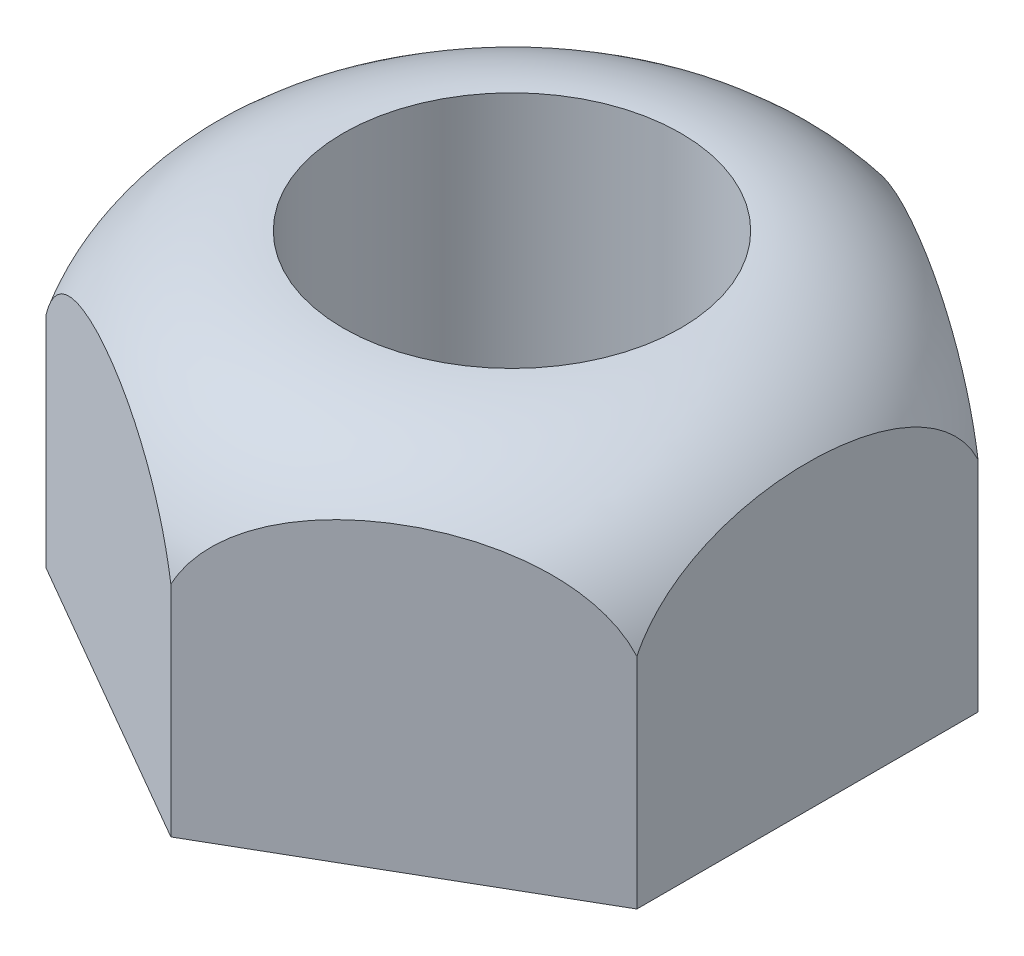
ISO-10303-21;
HEADER;
FILE_DESCRIPTION(('STEP AP214'),'2;1');
FILE_NAME('part.step','',(''),(''),'','','');
FILE_SCHEMA(('AUTOMOTIVE_DESIGN { 1 0 10303 214 1 1 1 1 }'));
ENDSEC;
DATA;
#1=APPLICATION_CONTEXT('core data for automotive mechanical design processes');
#2=APPLICATION_PROTOCOL_DEFINITION('international standard','automotive_design',2000,#1);
#3=PRODUCT_CONTEXT('',#1,'mechanical');
#4=PRODUCT('Part','Part','',(#3));
#5=PRODUCT_RELATED_PRODUCT_CATEGORY('part','',(#4));
#6=PRODUCT_DEFINITION_FORMATION('','',#4);
#7=PRODUCT_DEFINITION_CONTEXT('part definition',#1,'design');
#8=PRODUCT_DEFINITION('design','',#6,#7);
#9=PRODUCT_DEFINITION_SHAPE('','',#8);
#10=(LENGTH_UNIT() NAMED_UNIT(*) SI_UNIT(.MILLI.,.METRE.));
#11=(NAMED_UNIT(*) PLANE_ANGLE_UNIT() SI_UNIT($,.RADIAN.));
#12=(NAMED_UNIT(*) SI_UNIT($,.STERADIAN.) SOLID_ANGLE_UNIT());
#13=UNCERTAINTY_MEASURE_WITH_UNIT(LENGTH_MEASURE(1.E-05),#10,'distance_accuracy_value','');
#14=(GEOMETRIC_REPRESENTATION_CONTEXT(3) GLOBAL_UNCERTAINTY_ASSIGNED_CONTEXT((#13)) GLOBAL_UNIT_ASSIGNED_CONTEXT((#10,
#11,#12)) REPRESENTATION_CONTEXT('',''));
#15=CARTESIAN_POINT('',(0.,0.,0.));
#16=DIRECTION('',(0.,0.,1.));
#17=DIRECTION('',(1.,0.,0.));
#18=AXIS2_PLACEMENT_3D('',#15,#16,#17);
#19=CARTESIAN_POINT('',(0.,-2.1,0.));
#20=DIRECTION('',(0.,1.,0.));
#21=DIRECTION('',(0.,0.,1.));
#22=AXIS2_PLACEMENT_3D('',#19,#20,#21);
#23=PLANE('',#22);
#24=DIRECTION('',(0.,0.,-1.));
#25=VECTOR('',#24,1.);
#26=CARTESIAN_POINT('',(3.49999999999999,-2.1,2.0207259421637));
#27=LINE('',#26,#25);
#28=CARTESIAN_POINT('',(3.49999999999999,-2.1,2.0207259421637));
#29=VERTEX_POINT('',#28);
#30=CARTESIAN_POINT('',(3.49999999999999,-2.1,-2.02072594216369));
#31=VERTEX_POINT('',#30);
#32=EDGE_CURVE('E132',#29,#31,#27,.T.);
#33=ORIENTED_EDGE('',*,*,#32,.F.);
#34=DIRECTION('',(0.866025403784439,0.,-0.5));
#35=VECTOR('',#34,1.);
#36=CARTESIAN_POINT('',(0.,-2.1,4.04145188432738));
#37=LINE('',#36,#35);
#38=CARTESIAN_POINT('',(0.,-2.1,4.04145188432738));
#39=VERTEX_POINT('',#38);
#40=EDGE_CURVE('E121',#39,#29,#37,.T.);
#41=ORIENTED_EDGE('',*,*,#40,.F.);
#42=DIRECTION('',(0.866025403784439,0.,0.5));
#43=VECTOR('',#42,1.);
#44=CARTESIAN_POINT('',(-3.5,-2.1,2.02072594216369));
#45=LINE('',#44,#43);
#46=CARTESIAN_POINT('',(-3.5,-2.1,2.02072594216369));
#47=VERTEX_POINT('',#46);
#48=EDGE_CURVE('E123',#47,#39,#45,.T.);
#49=ORIENTED_EDGE('',*,*,#48,.F.);
#50=DIRECTION('',(0.,0.,1.));
#51=VECTOR('',#50,1.);
#52=CARTESIAN_POINT('',(-3.5,-2.1,-2.02072594216369));
#53=LINE('',#52,#51);
#54=CARTESIAN_POINT('',(-3.5,-2.1,-2.02072594216369));
#55=VERTEX_POINT('',#54);
#56=EDGE_CURVE('E126',#55,#47,#53,.T.);
#57=ORIENTED_EDGE('',*,*,#56,.F.);
#58=DIRECTION('',(-0.866025403784439,0.,0.5));
#59=VECTOR('',#58,1.);
#60=CARTESIAN_POINT('',(0.,-2.1,-4.04145188432738));
#61=LINE('',#60,#59);
#62=CARTESIAN_POINT('',(0.,-2.1,-4.04145188432738));
#63=VERTEX_POINT('',#62);
#64=EDGE_CURVE('E129',#63,#55,#61,.T.);
#65=ORIENTED_EDGE('',*,*,#64,.F.);
#66=DIRECTION('',(-0.866025403784439,0.,-0.5));
#67=VECTOR('',#66,1.);
#68=CARTESIAN_POINT('',(3.49999999999999,-2.1,-2.02072594216369));
#69=LINE('',#68,#67);
#70=EDGE_CURVE('E112',#31,#63,#69,.T.);
#71=ORIENTED_EDGE('',*,*,#70,.F.);
#72=EDGE_LOOP('',(#33,#41,#49,#57,#65,#71));
#73=FACE_BOUND('',#72,.T.);
#74=CARTESIAN_POINT('',(0.,-2.1,0.));
#75=DIRECTION('',(0.,1.,0.));
#76=DIRECTION('',(0.,0.,1.));
#77=AXIS2_PLACEMENT_3D('',#74,#75,#76);
#78=CIRCLE('',#77,2.);
#79=CARTESIAN_POINT('',(0.,-2.1,2.));
#80=VERTEX_POINT('',#79);
#81=EDGE_CURVE('E134',#80,#80,#78,.T.);
#82=ORIENTED_EDGE('',*,*,#81,.T.);
#83=EDGE_LOOP('',(#82));
#84=FACE_BOUND('',#83,.T.);
#85=ADVANCED_FACE('F39',(#73,#84),#23,.F.);
#86=CARTESIAN_POINT('',(3.49999999999999,2.1,2.0207259421637));
#87=DIRECTION('',(-1.,0.,0.));
#88=DIRECTION('',(0.,0.,1.));
#89=AXIS2_PLACEMENT_3D('',#86,#87,#88);
#90=PLANE('',#89);
#91=DIRECTION('',(0.,-1.,0.));
#92=VECTOR('',#91,1.);
#93=CARTESIAN_POINT('',(3.49999999999999,2.1,-2.02072594216369));
#94=LINE('',#93,#92);
#95=CARTESIAN_POINT('',(3.5,0.492416697499378,-2.02072594216369));
#96=VERTEX_POINT('',#95);
#97=EDGE_CURVE('E11',#96,#31,#94,.T.);
#98=ORIENTED_EDGE('',*,*,#97,.F.);
#99=CARTESIAN_POINT('',(3.49999999999999,1.46969384566992,0.));
#100=CARTESIAN_POINT('',(3.49999999999999,1.46969469681299,0.0872928396964926));
#101=CARTESIAN_POINT('',(3.49999999999999,1.46637148434232,0.174600692352799));
#102=CARTESIAN_POINT('',(3.49999999999999,1.45294315491615,0.348749909891187));
#103=CARTESIAN_POINT('',(3.49999999999999,1.44283361680478,0.435590933442657));
#104=CARTESIAN_POINT('',(3.49999999999999,1.41542698759788,0.608194749372097));
#105=CARTESIAN_POINT('',(3.49999999999999,1.39812652753422,0.693957016920933));
#106=CARTESIAN_POINT('',(3.49999999999999,1.35572755793952,0.863479327135727));
#107=CARTESIAN_POINT('',(3.49999999999999,1.3306353618083,0.947240931913338));
#108=CARTESIAN_POINT('',(3.49999999999999,1.26669834299236,1.12611858766857));
#109=CARTESIAN_POINT('',(3.49999999999999,1.22621743499538,1.22066429741375));
#110=CARTESIAN_POINT('',(3.49999999999999,1.13197192052538,1.40283757892941));
#111=CARTESIAN_POINT('',(3.49999999999999,1.07823308237703,1.49047814078045));
#112=CARTESIAN_POINT('',(3.49999999999999,0.968177873604442,1.63915337816182));
#113=CARTESIAN_POINT('',(3.49999999999999,0.914393197267569,1.70204825890644));
#114=CARTESIAN_POINT('',(3.49999999999999,0.797309255090569,1.81832771254654));
#115=CARTESIAN_POINT('',(3.49999999999999,0.734019975553616,1.87172214024478));
#116=CARTESIAN_POINT('',(3.49999999999999,0.610837048249661,1.95746258366422));
#117=CARTESIAN_POINT('',(3.49999999999999,0.552381061112015,1.99186717364567));
#118=CARTESIAN_POINT('',(3.49999999999999,0.430543993738031,2.05050430890519));
#119=CARTESIAN_POINT('',(3.49999999999999,0.367165416654398,2.07474198447409));
#120=CARTESIAN_POINT('',(3.49999999999999,0.236751257339865,2.11167924090477));
#121=CARTESIAN_POINT('',(3.49999999999999,0.169698988414051,2.12432057937812));
#122=CARTESIAN_POINT('',(3.49999999999999,0.0344103928911742,2.13697489402631));
#123=CARTESIAN_POINT('',(3.49999999999999,-0.0338256011753804,2.13699136110363));
#124=CARTESIAN_POINT('',(3.49999999999999,-0.163321958725095,2.1249517549612));
#125=CARTESIAN_POINT('',(3.49999999999999,-0.224681308911097,2.11392416654206));
#126=CARTESIAN_POINT('',(3.49999999999999,-0.344741515828849,2.08196944417041));
#127=CARTESIAN_POINT('',(3.49999999999999,-0.403442407742975,2.06104244126999));
#128=CARTESIAN_POINT('',(3.49999999999999,-0.518349314833025,2.00971668720605));
#129=CARTESIAN_POINT('',(3.49999999999999,-0.574450836332687,1.97908590025458));
#130=CARTESIAN_POINT('',(3.49999999999999,-0.681562424902686,1.90997576169899));
#131=CARTESIAN_POINT('',(3.49999999999999,-0.732569836872248,1.87149234869839));
#132=CARTESIAN_POINT('',(3.49999999999999,-0.849811006061305,1.77012997872157));
#133=CARTESIAN_POINT('',(3.49999999999999,-0.913139583382207,1.70388298509463));
#134=CARTESIAN_POINT('',(3.49999999999999,-1.02823339940552,1.56202890971472));
#135=CARTESIAN_POINT('',(3.49999999999999,-1.07997622322765,1.48640411637283));
#136=CARTESIAN_POINT('',(3.49999999999999,-1.19179296534923,1.2959829052979));
#137=CARTESIAN_POINT('',(3.49999999999999,-1.24637571361214,1.17798012576199));
#138=CARTESIAN_POINT('',(3.49999999999999,-1.33648790558154,0.934879940149161));
#139=CARTESIAN_POINT('',(3.49999999999999,-1.37197069701906,0.809765980651725));
#140=CARTESIAN_POINT('',(3.49999999999999,-1.41847063332267,0.592787150032632));
#141=CARTESIAN_POINT('',(3.49999999999999,-1.43359454058394,0.501760456588978));
#142=CARTESIAN_POINT('',(3.49999999999999,-1.45607436502375,0.318708968646061));
#143=CARTESIAN_POINT('',(3.49999999999999,-1.46342640920135,0.22668369957522));
#144=CARTESIAN_POINT('',(3.49999999999999,-1.47067977063359,0.0422895043051574));
#145=CARTESIAN_POINT('',(3.49999999999999,-1.47057662318108,-0.0500795946972574));
#146=CARTESIAN_POINT('',(3.49999999999999,-1.46289953224665,-0.234460921168983));
#147=CARTESIAN_POINT('',(3.49999999999999,-1.45532853499257,-0.326473275010017));
#148=CARTESIAN_POINT('',(3.49999999999999,-1.42626033068405,-0.558689295101583));
#149=CARTESIAN_POINT('',(3.49999999999999,-1.39947285823544,-0.698280608642018));
#150=CARTESIAN_POINT('',(3.49999999999999,-1.32500968649052,-0.9716514385344));
#151=CARTESIAN_POINT('',(3.49999999999999,-1.27739328513953,-1.10544627707333));
#152=CARTESIAN_POINT('',(3.49999999999999,-1.17697857591434,-1.32038983524164));
#153=CARTESIAN_POINT('',(3.49999999999999,-1.13079373305344,-1.40461089359238));
#154=CARTESIAN_POINT('',(3.49999999999999,-1.02607432695224,-1.56505676339435));
#155=CARTESIAN_POINT('',(3.49999999999999,-0.967555595820099,-1.64129164009851));
#156=CARTESIAN_POINT('',(3.49999999999999,-0.851061372178165,-1.76752362566773));
#157=CARTESIAN_POINT('',(3.49999999999999,-0.79545121805557,-1.81969193596125));
#158=CARTESIAN_POINT('',(3.49999999999999,-0.676421007753546,-1.91431152183236));
#159=CARTESIAN_POINT('',(3.49999999999999,-0.613003641133503,-1.95676612942163));
#160=CARTESIAN_POINT('',(3.49999999999999,-0.478826201000356,-2.02980185605494));
#161=CARTESIAN_POINT('',(3.49999999999999,-0.408004722477971,-2.06027174167873));
#162=CARTESIAN_POINT('',(3.49999999999999,-0.261695663184681,-2.10645477096449));
#163=CARTESIAN_POINT('',(3.49999999999999,-0.186213026995317,-2.12218327518467));
#164=CARTESIAN_POINT('',(3.49999999999999,-0.0450321757463029,-2.13643213863746));
#165=CARTESIAN_POINT('',(3.49999999999999,0.0204492228953226,-2.13716624366765));
#166=CARTESIAN_POINT('',(3.49999999999999,0.150484659806522,-2.12697998599447));
#167=CARTESIAN_POINT('',(3.49999999999999,0.215038953345401,-2.11606289619551));
#168=CARTESIAN_POINT('',(3.49999999999999,0.338041936561903,-2.08411751590804));
#169=CARTESIAN_POINT('',(3.49999999999999,0.396634129373206,-2.0636327481581));
#170=CARTESIAN_POINT('',(3.49999999999999,0.509933322246887,-2.013875257231));
#171=CARTESIAN_POINT('',(3.49999999999999,0.564639635032908,-1.98460098425954));
#172=CARTESIAN_POINT('',(3.49999999999999,0.673790174429123,-1.91571409469503));
#173=CARTESIAN_POINT('',(3.49999999999999,0.72780757398387,-1.87542906873693));
#174=CARTESIAN_POINT('',(3.49999999999999,0.829655765597162,-1.78772886606611));
#175=CARTESIAN_POINT('',(3.49999999999999,0.877483570591255,-1.74031027042539));
#176=CARTESIAN_POINT('',(3.49999999999999,0.991049053864749,-1.61265245127682));
#177=CARTESIAN_POINT('',(3.49999999999999,1.05245471950013,-1.52854834499657));
#178=CARTESIAN_POINT('',(3.49999999999999,1.16108627050349,-1.35155769098591));
#179=CARTESIAN_POINT('',(3.49999999999999,1.20826855421297,-1.25864526301792));
#180=CARTESIAN_POINT('',(3.49999999999999,1.30864001247112,-1.02317203283791));
#181=CARTESIAN_POINT('',(3.49999999999999,1.35451865818983,-0.877519675434749));
#182=CARTESIAN_POINT('',(3.49999999999999,1.42308932342614,-0.581224147764356));
#183=CARTESIAN_POINT('',(3.49999999999999,1.44579457583174,-0.430583876586342));
#184=CARTESIAN_POINT('',(3.49999999999999,1.46207913645138,-0.232812980619406));
#185=CARTESIAN_POINT('',(3.49999999999999,1.4649383385905,-0.186304465838094));
#186=CARTESIAN_POINT('',(3.49999999999999,1.46874558356013,-0.0931987337327399));
#187=CARTESIAN_POINT('',(3.49999999999999,1.469693391285,-0.0466015062023257));
#188=CARTESIAN_POINT('',(3.49999999999999,1.46969384566992,0.));
#189=B_SPLINE_CURVE_WITH_KNOTS('',3,(#99,#100,#101,#102,#103,#104,#105,#106,#107,#108,#109,#110,
#111,#112,#113,#114,#115,#116,#117,#118,#119,#120,#121,#122,#123,#124,#125,#126,#127,#128,#129,
#130,#131,#132,#133,#134,#135,#136,#137,#138,#139,#140,#141,#142,#143,#144,#145,#146,#147,#148,
#149,#150,#151,#152,#153,#154,#155,#156,#157,#158,#159,#160,#161,#162,#163,#164,#165,#166,#167,
#168,#169,#170,#171,#172,#173,#174,#175,#176,#177,#178,#179,#180,#181,#182,#183,#184,#185,#186,
#187,#188),.UNSPECIFIED.,.T.,.F.,(4,2,2,2,2,2,2,2,2,2,2,2,2,2,2,2,2,2,2,2,2,2,2,2,2,2,2,2,2,2,2,
2,2,2,2,2,2,2,2,2,2,2,2,2,4),(0.,0.261839260270762,0.52384926936557,0.785982169530985,
1.04790322340596,1.35554605520653,1.6625955941638,1.90995786610123,2.15706203443719,
2.35970910340572,2.56225379198,2.76581027508842,2.9693104727848,3.15547205063287,
3.34163116407439,3.53262857118409,3.72372501412844,3.9971344475779,4.27106835971687,
4.65897849614371,5.04783186528775,5.3243312885646,5.60096843665895,5.87777125642822,
6.15446491517499,6.57951087210662,7.00335456059242,7.29062800296136,7.57753491511161,
7.80541277026355,8.03321234076415,8.26307892457017,8.49270571962334,8.68813791332848,
8.88351522317108,9.06893775683332,9.254393004022,9.45579126052522,9.65728635113221,
9.96792689300982,10.2795102375555,10.7351688401096,11.190567098462,11.3303334681311,
11.4701170283171),.UNSPECIFIED.);
#190=CARTESIAN_POINT('',(3.5,0.492416697499378,2.02072594216369));
#191=VERTEX_POINT('',#190);
#192=EDGE_CURVE('E97',#96,#191,#189,.T.);
#193=ORIENTED_EDGE('',*,*,#192,.T.);
#194=DIRECTION('',(0.,-1.,0.));
#195=VECTOR('',#194,1.);
#196=CARTESIAN_POINT('',(3.49999999999999,2.1,2.0207259421637));
#197=LINE('',#196,#195);
#198=EDGE_CURVE('E63',#191,#29,#197,.T.);
#199=ORIENTED_EDGE('',*,*,#198,.T.);
#200=ORIENTED_EDGE('',*,*,#32,.T.);
#201=EDGE_LOOP('',(#98,#193,#199,#200));
#202=FACE_BOUND('',#201,.T.);
#203=ADVANCED_FACE('F41',(#202),#90,.F.);
#204=CARTESIAN_POINT('',(3.49999999999999,2.1,-2.02072594216369));
#205=DIRECTION('',(-0.5,0.,0.866025403784439));
#206=DIRECTION('',(0.866025403784439,0.,0.5));
#207=AXIS2_PLACEMENT_3D('',#204,#205,#206);
#208=PLANE('',#207);
#209=DIRECTION('',(0.,-1.,0.));
#210=VECTOR('',#209,1.);
#211=CARTESIAN_POINT('',(0.,2.1,-4.04145188432738));
#212=LINE('',#211,#210);
#213=CARTESIAN_POINT('',(0.,0.492416697499378,-4.04145188432738));
#214=VERTEX_POINT('',#213);
#215=EDGE_CURVE('E48',#214,#63,#212,.T.);
#216=ORIENTED_EDGE('',*,*,#215,.F.);
#217=CARTESIAN_POINT('',(-8.35378196447012E-05,0.492216697499378,-4.04150011491004));
#218=CARTESIAN_POINT('',(0.0171160696103398,0.533417329789821,-4.03156991693038));
#219=CARTESIAN_POINT('',(0.0363117550919718,0.573442480319325,-4.02048728275028));
#220=CARTESIAN_POINT('',(0.0782177471073857,0.650855214126888,-3.99629284697952));
#221=CARTESIAN_POINT('',(0.100920977345173,0.688247891927272,-3.98318513089026));
#222=CARTESIAN_POINT('',(0.173071488970714,0.795363715077905,-3.94152901358109));
#223=CARTESIAN_POINT('',(0.227023768982133,0.8610899985712,-3.9103796501931));
#224=CARTESIAN_POINT('',(0.343109462655562,0.980612201821265,-3.84335754370168));
#225=CARTESIAN_POINT('',(0.405177513290285,1.03449508114959,-3.80752253795965));
#226=CARTESIAN_POINT('',(0.53544625163917,1.13169355163716,-3.73231184680693));
#227=CARTESIAN_POINT('',(0.603667196179457,1.17497235484709,-3.69292446611222));
#228=CARTESIAN_POINT('',(0.787450897874921,1.27528713046812,-3.58681689646568));
#229=CARTESIAN_POINT('',(0.906266110261227,1.32435006574584,-3.51821890161062));
#230=CARTESIAN_POINT('',(1.14913915743169,1.40063789917638,-3.37799608244785));
#231=CARTESIAN_POINT('',(1.27321149255214,1.42779761382597,-3.30636288636708));
#232=CARTESIAN_POINT('',(1.47925312366033,1.45669030386274,-3.18740469518249));
#233=CARTESIAN_POINT('',(1.56068118610748,1.46400668065254,-3.14039218140904));
#234=CARTESIAN_POINT('',(1.72382726365904,1.47086190872961,-3.04619974961741));
#235=CARTESIAN_POINT('',(1.80554538955666,1.47039737284993,-2.99901976763275));
#236=CARTESIAN_POINT('',(1.96856229210419,1.46167296766261,-2.90490191506447));
#237=CARTESIAN_POINT('',(2.04986148644691,1.45342364264233,-2.85796380332581));
#238=CARTESIAN_POINT('',(2.21148494539945,1.42877074730484,-2.7646504557922));
#239=CARTESIAN_POINT('',(2.29180977158937,1.41237212734659,-2.71827489576884));
#240=CARTESIAN_POINT('',(2.47302297026493,1.36489047708341,-2.6136514067328));
#241=CARTESIAN_POINT('',(2.57337720976353,1.33098271366022,-2.55571185954396));
#242=CARTESIAN_POINT('',(2.76874356296235,1.24658041012757,-2.44291704293402));
#243=CARTESIAN_POINT('',(2.86376328863935,1.19611024620524,-2.38805737873608));
#244=CARTESIAN_POINT('',(3.02195419998935,1.09128647438222,-2.29672581348481));
#245=CARTESIAN_POINT('',(3.08715535814276,1.041045874414,-2.25908190727346));
#246=CARTESIAN_POINT('',(3.20975476378954,0.929373435290711,-2.1882991074208));
#247=CARTESIAN_POINT('',(3.26717931490599,0.867981054465512,-2.15514502737563));
#248=CARTESIAN_POINT('',(3.35519018408893,0.754742804756452,-2.10433192836125));
#249=CARTESIAN_POINT('',(3.38858585560683,0.705811189453641,-2.08505092842062));
#250=CARTESIAN_POINT('',(3.44928626764797,0.60276275285901,-2.05000552918874));
#251=CARTESIAN_POINT('',(3.47655549597874,0.54861817400072,-2.03426163287138));
#252=CARTESIAN_POINT('',(3.50008353781964,0.49221669749938,-2.02067771158103));
#253=B_SPLINE_CURVE_WITH_KNOTS('',3,(#217,#218,#219,#220,#221,#222,#223,#224,#225,#226,#227,
#228,#229,#230,#231,#232,#233,#234,#235,#236,#237,#238,#239,#240,#241,#242,#243,#244,#245,#246,
#247,#248,#249,#250,#251,#252),.UNSPECIFIED.,.F.,.F.,(4,2,2,2,2,2,2,2,2,2,2,2,2,2,2,2,2,4),(0.,
0.137044786700755,0.273816618304945,0.543848770664639,0.811826574961083,1.0807212943321,
1.51542531365603,1.9514182775404,2.23405314890969,2.51681105936256,2.7991865307058,
3.08139067994313,3.4425479121568,3.80317596708909,4.07379868824535,4.34348188451733,
4.5298109432575,4.71719369330563),.UNSPECIFIED.);
#254=EDGE_CURVE('E92',#214,#96,#253,.T.);
#255=ORIENTED_EDGE('',*,*,#254,.T.);
#256=ORIENTED_EDGE('',*,*,#97,.T.);
#257=ORIENTED_EDGE('',*,*,#70,.T.);
#258=EDGE_LOOP('',(#216,#255,#256,#257));
#259=FACE_BOUND('',#258,.T.);
#260=ADVANCED_FACE('F110',(#259),#208,.F.);
#261=CARTESIAN_POINT('',(0.,2.1,-4.04145188432738));
#262=DIRECTION('',(0.5,0.,0.866025403784439));
#263=DIRECTION('',(0.866025403784439,0.,-0.5));
#264=AXIS2_PLACEMENT_3D('',#261,#262,#263);
#265=PLANE('',#264);
#266=DIRECTION('',(0.,-1.,0.));
#267=VECTOR('',#266,1.);
#268=CARTESIAN_POINT('',(-3.5,2.1,-2.02072594216369));
#269=LINE('',#268,#267);
#270=CARTESIAN_POINT('',(-3.5,0.492416697499378,-2.02072594216368));
#271=VERTEX_POINT('',#270);
#272=EDGE_CURVE('E107',#271,#55,#269,.T.);
#273=ORIENTED_EDGE('',*,*,#272,.F.);
#274=CARTESIAN_POINT('',(-3.50008353781964,0.492216697499378,-2.02067771158103));
#275=CARTESIAN_POINT('',(-3.48288393038966,0.533417329789822,-2.03060790956069));
#276=CARTESIAN_POINT('',(-3.46368824490803,0.573442480319326,-2.04169054374079));
#277=CARTESIAN_POINT('',(-3.42178225289261,0.650855214126888,-2.06588497951155));
#278=CARTESIAN_POINT('',(-3.39907902265482,0.688247891927272,-2.07899269560081));
#279=CARTESIAN_POINT('',(-3.32692851102928,0.795363715077904,-2.12064881290998));
#280=CARTESIAN_POINT('',(-3.27297623101786,0.861089998571199,-2.15179817629797));
#281=CARTESIAN_POINT('',(-3.15689053734444,0.980612201821265,-2.21882028278939));
#282=CARTESIAN_POINT('',(-3.09482248670971,1.03449508114959,-2.25465528853142));
#283=CARTESIAN_POINT('',(-2.96455374836083,1.13169355163716,-2.32986597968414));
#284=CARTESIAN_POINT('',(-2.89633280382054,1.17497235484709,-2.36925336037885));
#285=CARTESIAN_POINT('',(-2.71254910212508,1.27528713046812,-2.47536093002539));
#286=CARTESIAN_POINT('',(-2.59373388973877,1.32435006574583,-2.54395892488045));
#287=CARTESIAN_POINT('',(-2.35086084256831,1.40063789917638,-2.68418174404322));
#288=CARTESIAN_POINT('',(-2.22678850744786,1.42779761382597,-2.75581494012399));
#289=CARTESIAN_POINT('',(-2.02074687633967,1.45669030386274,-2.87477313130858));
#290=CARTESIAN_POINT('',(-1.93931881389252,1.46400668065254,-2.92178564508203));
#291=CARTESIAN_POINT('',(-1.77617273634096,1.4708619087296,-3.01597807687366));
#292=CARTESIAN_POINT('',(-1.69445461044333,1.47039737284992,-3.06315805885832));
#293=CARTESIAN_POINT('',(-1.5314377078958,1.4616729676626,-3.1572759114266));
#294=CARTESIAN_POINT('',(-1.45013851355309,1.45342364264232,-3.20421402316526));
#295=CARTESIAN_POINT('',(-1.28851505460055,1.42877074730483,-3.29752737069887));
#296=CARTESIAN_POINT('',(-1.20819022841063,1.41237212734659,-3.34390293072223));
#297=CARTESIAN_POINT('',(-1.02697702973508,1.36489047708341,-3.44852641975827));
#298=CARTESIAN_POINT('',(-0.926622790236474,1.33098271366022,-3.50646596694711));
#299=CARTESIAN_POINT('',(-0.731256437037652,1.24658041012757,-3.61926078355705));
#300=CARTESIAN_POINT('',(-0.636236711360655,1.19611024620524,-3.67412044775499));
#301=CARTESIAN_POINT('',(-0.478045800010653,1.09128647438222,-3.76545201300626));
#302=CARTESIAN_POINT('',(-0.412844641857247,1.04104587441399,-3.80309591921761));
#303=CARTESIAN_POINT('',(-0.290245236210461,0.929373435290709,-3.87387871907027));
#304=CARTESIAN_POINT('',(-0.232820685094015,0.867981054465512,-3.90703279911544));
#305=CARTESIAN_POINT('',(-0.144809815911076,0.75474280475645,-3.95784589812982));
#306=CARTESIAN_POINT('',(-0.111414144393177,0.70581118945364,-3.97712689807045));
#307=CARTESIAN_POINT('',(-0.0507137323520324,0.602762752859008,-4.01217229730232));
#308=CARTESIAN_POINT('',(-0.0234445040212661,0.548618174000718,-4.02791619361969));
#309=CARTESIAN_POINT('',(8.35378196393996E-05,0.49221669749938,-4.04150011491004));
#310=B_SPLINE_CURVE_WITH_KNOTS('',3,(#274,#275,#276,#277,#278,#279,#280,#281,#282,#283,#284,
#285,#286,#287,#288,#289,#290,#291,#292,#293,#294,#295,#296,#297,#298,#299,#300,#301,#302,#303,
#304,#305,#306,#307,#308,#309),.UNSPECIFIED.,.F.,.F.,(4,2,2,2,2,2,2,2,2,2,2,2,2,2,2,2,2,4),(0.,
0.137044786700756,0.273816618304945,0.543848770664639,0.811826574961083,1.0807212943321,
1.51542531365603,1.9514182775404,2.23405314890969,2.51681105936256,2.7991865307058,
3.08139067994313,3.44254791215679,3.80317596708909,4.07379868824534,4.34348188451732,
4.52981094325749,4.71719369330562),.UNSPECIFIED.);
#311=EDGE_CURVE('E95',#271,#214,#310,.T.);
#312=ORIENTED_EDGE('',*,*,#311,.T.);
#313=ORIENTED_EDGE('',*,*,#215,.T.);
#314=ORIENTED_EDGE('',*,*,#64,.T.);
#315=EDGE_LOOP('',(#273,#312,#313,#314));
#316=FACE_BOUND('',#315,.T.);
#317=ADVANCED_FACE('F104',(#316),#265,.F.);
#318=CARTESIAN_POINT('',(-3.5,2.1,-2.02072594216369));
#319=DIRECTION('',(1.,0.,0.));
#320=DIRECTION('',(0.,0.,-1.));
#321=AXIS2_PLACEMENT_3D('',#318,#319,#320);
#322=PLANE('',#321);
#323=DIRECTION('',(0.,-1.,0.));
#324=VECTOR('',#323,1.);
#325=CARTESIAN_POINT('',(-3.5,2.1,2.02072594216369));
#326=LINE('',#325,#324);
#327=CARTESIAN_POINT('',(-3.49999999999999,0.492416697499378,2.0207259421637));
#328=VERTEX_POINT('',#327);
#329=EDGE_CURVE('E114',#328,#47,#326,.T.);
#330=ORIENTED_EDGE('',*,*,#329,.F.);
#331=CARTESIAN_POINT('',(-3.5,1.46969384566991,0.));
#332=CARTESIAN_POINT('',(-3.5,1.46969469681298,-0.0872928396964877));
#333=CARTESIAN_POINT('',(-3.5,1.46637148434231,-0.174600692352795));
#334=CARTESIAN_POINT('',(-3.5,1.45294315491614,-0.348749909891184));
#335=CARTESIAN_POINT('',(-3.5,1.44283361680477,-0.435590933442655));
#336=CARTESIAN_POINT('',(-3.5,1.41542698759787,-0.608194749372096));
#337=CARTESIAN_POINT('',(-3.5,1.39812652753421,-0.693957016920932));
#338=CARTESIAN_POINT('',(-3.5,1.35572755793951,-0.863479327135727));
#339=CARTESIAN_POINT('',(-3.5,1.33063536180829,-0.947240931913339));
#340=CARTESIAN_POINT('',(-3.5,1.26669834299235,-1.12611858766856));
#341=CARTESIAN_POINT('',(-3.5,1.22621743499537,-1.22066429741375));
#342=CARTESIAN_POINT('',(-3.5,1.13197192052537,-1.40283757892941));
#343=CARTESIAN_POINT('',(-3.5,1.07823308237702,-1.49047814078044));
#344=CARTESIAN_POINT('',(-3.5,0.96817787360443,-1.63915337816182));
#345=CARTESIAN_POINT('',(-3.5,0.914393197267556,-1.70204825890643));
#346=CARTESIAN_POINT('',(-3.5,0.797309255090557,-1.81832771254652));
#347=CARTESIAN_POINT('',(-3.5,0.734019975553605,-1.87172214024477));
#348=CARTESIAN_POINT('',(-3.5,0.610837048249651,-1.95746258366421));
#349=CARTESIAN_POINT('',(-3.5,0.552381061112005,-1.99186717364566));
#350=CARTESIAN_POINT('',(-3.5,0.430543993738022,-2.05050430890518));
#351=CARTESIAN_POINT('',(-3.5,0.36716541665439,-2.07474198447407));
#352=CARTESIAN_POINT('',(-3.5,0.236751257339857,-2.11167924090475));
#353=CARTESIAN_POINT('',(-3.5,0.169698988414044,-2.1243205793781));
#354=CARTESIAN_POINT('',(-3.5,0.0344103928911689,-2.13697489402629));
#355=CARTESIAN_POINT('',(-3.5,-0.0338256011753852,-2.13699136110361));
#356=CARTESIAN_POINT('',(-3.5,-0.163321958725098,-2.12495175496118));
#357=CARTESIAN_POINT('',(-3.5,-0.2246813089111,-2.11392416654204));
#358=CARTESIAN_POINT('',(-3.5,-0.34474151582885,-2.08196944417039));
#359=CARTESIAN_POINT('',(-3.5,-0.403442407742976,-2.06104244126997));
#360=CARTESIAN_POINT('',(-3.5,-0.518349314833026,-2.00971668720604));
#361=CARTESIAN_POINT('',(-3.5,-0.574450836332687,-1.97908590025456));
#362=CARTESIAN_POINT('',(-3.5,-0.681562424902685,-1.90997576169897));
#363=CARTESIAN_POINT('',(-3.5,-0.732569836872247,-1.87149234869837));
#364=CARTESIAN_POINT('',(-3.5,-0.849811006061303,-1.77012997872155));
#365=CARTESIAN_POINT('',(-3.5,-0.913139583382204,-1.70388298509461));
#366=CARTESIAN_POINT('',(-3.5,-1.02823339940552,-1.5620289097147));
#367=CARTESIAN_POINT('',(-3.5,-1.07997622322764,-1.48640411637282));
#368=CARTESIAN_POINT('',(-3.5,-1.19179296534923,-1.29598290529788));
#369=CARTESIAN_POINT('',(-3.5,-1.24637571361213,-1.17798012576197));
#370=CARTESIAN_POINT('',(-3.5,-1.33648790558153,-0.934879940149142));
#371=CARTESIAN_POINT('',(-3.5,-1.37197069701905,-0.809765980651706));
#372=CARTESIAN_POINT('',(-3.5,-1.41847063332267,-0.592787150032614));
#373=CARTESIAN_POINT('',(-3.5,-1.43359454058393,-0.501760456588961));
#374=CARTESIAN_POINT('',(-3.5,-1.45607436502374,-0.318708968646044));
#375=CARTESIAN_POINT('',(-3.5,-1.46342640920134,-0.226683699575205));
#376=CARTESIAN_POINT('',(-3.5,-1.47067977063358,-0.0422895043051429));
#377=CARTESIAN_POINT('',(-3.5,-1.47057662318107,0.0500795946972714));
#378=CARTESIAN_POINT('',(-3.5,-1.46289953224663,0.234460921168995));
#379=CARTESIAN_POINT('',(-3.5,-1.45532853499256,0.326473275010028));
#380=CARTESIAN_POINT('',(-3.5,-1.42626033068403,0.558689295101592));
#381=CARTESIAN_POINT('',(-3.5,-1.39947285823543,0.698280608642024));
#382=CARTESIAN_POINT('',(-3.5,-1.32500968649051,0.971651438534403));
#383=CARTESIAN_POINT('',(-3.5,-1.27739328513952,1.10544627707333));
#384=CARTESIAN_POINT('',(-3.5,-1.17697857591433,1.32038983524163));
#385=CARTESIAN_POINT('',(-3.5,-1.13079373305343,1.40461089359238));
#386=CARTESIAN_POINT('',(-3.5,-1.02607432695223,1.56505676339434));
#387=CARTESIAN_POINT('',(-3.5,-0.967555595820087,1.6412916400985));
#388=CARTESIAN_POINT('',(-3.5,-0.851061372178153,1.76752362566773));
#389=CARTESIAN_POINT('',(-3.5,-0.795451218055559,1.81969193596124));
#390=CARTESIAN_POINT('',(-3.5,-0.676421007753536,1.91431152183235));
#391=CARTESIAN_POINT('',(-3.5,-0.613003641133494,1.95676612942162));
#392=CARTESIAN_POINT('',(-3.5,-0.478826201000348,2.02980185605493));
#393=CARTESIAN_POINT('',(-3.5,-0.408004722477965,2.06027174167872));
#394=CARTESIAN_POINT('',(-3.5,-0.261695663184676,2.10645477096448));
#395=CARTESIAN_POINT('',(-3.5,-0.186213026995313,2.12218327518465));
#396=CARTESIAN_POINT('',(-3.5,-0.0450321757462993,2.13643213863744));
#397=CARTESIAN_POINT('',(-3.5,0.0204492228953257,2.13716624366763));
#398=CARTESIAN_POINT('',(-3.5,0.150484659806524,2.12697998599445));
#399=CARTESIAN_POINT('',(-3.5,0.215038953345402,2.11606289619549));
#400=CARTESIAN_POINT('',(-3.5,0.338041936561904,2.08411751590802));
#401=CARTESIAN_POINT('',(-3.5,0.396634129373207,2.06363274815809));
#402=CARTESIAN_POINT('',(-3.5,0.509933322246886,2.01387525723098));
#403=CARTESIAN_POINT('',(-3.5,0.564639635032906,1.98460098425952));
#404=CARTESIAN_POINT('',(-3.5,0.67379017442912,1.91571409469501));
#405=CARTESIAN_POINT('',(-3.5,0.727807573983866,1.87542906873691));
#406=CARTESIAN_POINT('',(-3.5,0.829655765597158,1.78772886606609));
#407=CARTESIAN_POINT('',(-3.5,0.87748357059125,1.74031027042537));
#408=CARTESIAN_POINT('',(-3.5,0.991049053864743,1.6126524512768));
#409=CARTESIAN_POINT('',(-3.5,1.05245471950012,1.52854834499655));
#410=CARTESIAN_POINT('',(-3.5,1.16108627050348,1.3515576909859));
#411=CARTESIAN_POINT('',(-3.5,1.20826855421296,1.25864526301791));
#412=CARTESIAN_POINT('',(-3.5,1.30864001247112,1.02317203283789));
#413=CARTESIAN_POINT('',(-3.5,1.35451865818983,0.877519675434736));
#414=CARTESIAN_POINT('',(-3.5,1.42308932342614,0.581224147764345));
#415=CARTESIAN_POINT('',(-3.5,1.44579457583173,0.430583876586331));
#416=CARTESIAN_POINT('',(-3.5,1.46207913645137,0.232812980619399));
#417=CARTESIAN_POINT('',(-3.5,1.46493833859049,0.18630446583809));
#418=CARTESIAN_POINT('',(-3.5,1.46874558356012,0.093198733732741));
#419=CARTESIAN_POINT('',(-3.5,1.46969339128499,0.0466015062023289));
#420=CARTESIAN_POINT('',(-3.5,1.46969384566991,0.));
#421=B_SPLINE_CURVE_WITH_KNOTS('',3,(#331,#332,#333,#334,#335,#336,#337,#338,#339,#340,#341,
#342,#343,#344,#345,#346,#347,#348,#349,#350,#351,#352,#353,#354,#355,#356,#357,#358,#359,#360,
#361,#362,#363,#364,#365,#366,#367,#368,#369,#370,#371,#372,#373,#374,#375,#376,#377,#378,#379,
#380,#381,#382,#383,#384,#385,#386,#387,#388,#389,#390,#391,#392,#393,#394,#395,#396,#397,#398,
#399,#400,#401,#402,#403,#404,#405,#406,#407,#408,#409,#410,#411,#412,#413,#414,#415,#416,#417,
#418,#419,#420),.UNSPECIFIED.,.T.,.F.,(4,2,2,2,2,2,2,2,2,2,2,2,2,2,2,2,2,2,2,2,2,2,2,2,2,2,2,2,
2,2,2,2,2,2,2,2,2,2,2,2,2,2,2,2,4),(0.,0.261839260270763,0.523849269365574,0.78598216953099,
1.04790322340597,1.35554605520653,1.6625955941638,1.90995786610123,2.15706203443719,
2.35970910340571,2.56225379197999,2.76581027508841,2.96931047278479,3.15547205063285,
3.34163116407437,3.53262857118408,3.72372501412842,3.99713444757788,4.27106835971685,
4.65897849614369,5.04783186528773,5.32433128856458,5.60096843665892,5.8777712564282,
6.15446491517497,6.57951087210658,7.00335456059238,7.29062800296132,7.57753491511156,
7.80541277026351,8.03321234076409,8.26307892457011,8.49270571962329,8.68813791332843,
8.88351522317102,9.06893775683326,9.25439300402194,9.45579126052515,9.65728635113214,
9.96792689300975,10.2795102375554,10.7351688401096,11.1905670984619,11.3303334681311,
11.4701170283171),.UNSPECIFIED.);
#422=EDGE_CURVE('E108',#328,#271,#421,.T.);
#423=ORIENTED_EDGE('',*,*,#422,.T.);
#424=ORIENTED_EDGE('',*,*,#272,.T.);
#425=ORIENTED_EDGE('',*,*,#56,.T.);
#426=EDGE_LOOP('',(#330,#423,#424,#425));
#427=FACE_BOUND('',#426,.T.);
#428=ADVANCED_FACE('F182',(#427),#322,.F.);
#429=CARTESIAN_POINT('',(-3.5,2.1,2.02072594216369));
#430=DIRECTION('',(0.5,0.,-0.866025403784439));
#431=DIRECTION('',(-0.866025403784439,0.,-0.5));
#432=AXIS2_PLACEMENT_3D('',#429,#430,#431);
#433=PLANE('',#432);
#434=DIRECTION('',(0.,-1.,0.));
#435=VECTOR('',#434,1.);
#436=CARTESIAN_POINT('',(0.,2.1,4.04145188432738));
#437=LINE('',#436,#435);
#438=CARTESIAN_POINT('',(0.,0.492416697499378,4.04145188432738));
#439=VERTEX_POINT('',#438);
#440=EDGE_CURVE('E118',#439,#39,#437,.T.);
#441=ORIENTED_EDGE('',*,*,#440,.F.);
#442=CARTESIAN_POINT('',(8.35378196345117E-05,0.492216697499379,4.04150011491004));
#443=CARTESIAN_POINT('',(-0.0171160696103498,0.533417329789821,4.03156991693038));
#444=CARTESIAN_POINT('',(-0.036311755091982,0.573442480319326,4.02048728275028));
#445=CARTESIAN_POINT('',(-0.0782177471073966,0.650855214126888,3.99629284697952));
#446=CARTESIAN_POINT('',(-0.100920977345185,0.688247891927272,3.98318513089026));
#447=CARTESIAN_POINT('',(-0.173071488970726,0.795363715077904,3.94152901358109));
#448=CARTESIAN_POINT('',(-0.227023768982144,0.861089998571199,3.9103796501931));
#449=CARTESIAN_POINT('',(-0.343109462655572,0.980612201821264,3.84335754370168));
#450=CARTESIAN_POINT('',(-0.405177513290295,1.03449508114959,3.80752253795965));
#451=CARTESIAN_POINT('',(-0.535446251639182,1.13169355163716,3.73231184680693));
#452=CARTESIAN_POINT('',(-0.603667196179469,1.17497235484709,3.69292446611222));
#453=CARTESIAN_POINT('',(-0.787450897874933,1.27528713046812,3.58681689646568));
#454=CARTESIAN_POINT('',(-0.906266110261239,1.32435006574583,3.51821890161062));
#455=CARTESIAN_POINT('',(-1.1491391574317,1.40063789917638,3.37799608244785));
#456=CARTESIAN_POINT('',(-1.27321149255215,1.42779761382596,3.30636288636708));
#457=CARTESIAN_POINT('',(-1.47925312366034,1.45669030386274,3.18740469518249));
#458=CARTESIAN_POINT('',(-1.56068118610749,1.46400668065254,3.14039218140904));
#459=CARTESIAN_POINT('',(-1.72382726365905,1.4708619087296,3.04619974961741));
#460=CARTESIAN_POINT('',(-1.80554538955667,1.47039737284992,2.99901976763275));
#461=CARTESIAN_POINT('',(-1.9685622921042,1.4616729676626,2.90490191506448));
#462=CARTESIAN_POINT('',(-2.04986148644691,1.45342364264232,2.85796380332581));
#463=CARTESIAN_POINT('',(-2.21148494539945,1.42877074730483,2.76465045579221));
#464=CARTESIAN_POINT('',(-2.29180977158937,1.41237212734658,2.71827489576885));
#465=CARTESIAN_POINT('',(-2.47302297026493,1.36489047708341,2.6136514067328));
#466=CARTESIAN_POINT('',(-2.57337720976353,1.33098271366022,2.55571185954396));
#467=CARTESIAN_POINT('',(-2.76874356296235,1.24658041012756,2.44291704293403));
#468=CARTESIAN_POINT('',(-2.86376328863935,1.19611024620524,2.38805737873609));
#469=CARTESIAN_POINT('',(-3.02195419998935,1.09128647438221,2.29672581348481));
#470=CARTESIAN_POINT('',(-3.08715535814276,1.04104587441399,2.25908190727347));
#471=CARTESIAN_POINT('',(-3.20975476378954,0.929373435290704,2.18829910742081));
#472=CARTESIAN_POINT('',(-3.26717931490599,0.867981054465506,2.15514502737564));
#473=CARTESIAN_POINT('',(-3.35519018408893,0.754742804756446,2.10433192836125));
#474=CARTESIAN_POINT('',(-3.38858585560682,0.705811189453636,2.08505092842063));
#475=CARTESIAN_POINT('',(-3.44928626764797,0.602762752859007,2.05000552918875));
#476=CARTESIAN_POINT('',(-3.47655549597873,0.548618174000718,2.03426163287139));
#477=CARTESIAN_POINT('',(-3.50008353781964,0.49221669749938,2.02067771158104));
#478=B_SPLINE_CURVE_WITH_KNOTS('',3,(#442,#443,#444,#445,#446,#447,#448,#449,#450,#451,#452,
#453,#454,#455,#456,#457,#458,#459,#460,#461,#462,#463,#464,#465,#466,#467,#468,#469,#470,#471,
#472,#473,#474,#475,#476,#477),.UNSPECIFIED.,.F.,.F.,(4,2,2,2,2,2,2,2,2,2,2,2,2,2,2,2,2,4),(0.,
0.137044786700755,0.273816618304945,0.543848770664639,0.811826574961083,1.0807212943321,
1.51542531365603,1.9514182775404,2.23405314890969,2.51681105936255,2.7991865307058,
3.08139067994313,3.44254791215679,3.80317596708908,4.07379868824533,4.34348188451731,
4.52981094325748,4.7171936933056),.UNSPECIFIED.);
#479=EDGE_CURVE('E55',#439,#328,#478,.T.);
#480=ORIENTED_EDGE('',*,*,#479,.T.);
#481=ORIENTED_EDGE('',*,*,#329,.T.);
#482=ORIENTED_EDGE('',*,*,#48,.T.);
#483=EDGE_LOOP('',(#441,#480,#481,#482));
#484=FACE_BOUND('',#483,.T.);
#485=ADVANCED_FACE('F199',(#484),#433,.F.);
#486=CARTESIAN_POINT('',(0.,2.1,4.04145188432738));
#487=DIRECTION('',(-0.5,0.,-0.866025403784439));
#488=DIRECTION('',(-0.866025403784439,0.,0.5));
#489=AXIS2_PLACEMENT_3D('',#486,#487,#488);
#490=PLANE('',#489);
#491=ORIENTED_EDGE('',*,*,#198,.F.);
#492=CARTESIAN_POINT('',(3.50008353781964,0.492216697499378,2.02067771158104));
#493=CARTESIAN_POINT('',(3.48288393038966,0.533417329789821,2.03060790956069));
#494=CARTESIAN_POINT('',(3.46368824490802,0.573442480319325,2.04169054374079));
#495=CARTESIAN_POINT('',(3.42178225289261,0.650855214126888,2.06588497951155));
#496=CARTESIAN_POINT('',(3.39907902265482,0.688247891927272,2.07899269560081));
#497=CARTESIAN_POINT('',(3.32692851102928,0.795363715077905,2.12064881290999));
#498=CARTESIAN_POINT('',(3.27297623101786,0.861089998571199,2.15179817629797));
#499=CARTESIAN_POINT('',(3.15689053734443,0.980612201821264,2.21882028278939));
#500=CARTESIAN_POINT('',(3.09482248670971,1.03449508114959,2.25465528853143));
#501=CARTESIAN_POINT('',(2.96455374836082,1.13169355163716,2.32986597968415));
#502=CARTESIAN_POINT('',(2.89633280382054,1.17497235484709,2.36925336037885));
#503=CARTESIAN_POINT('',(2.71254910212507,1.27528713046812,2.4753609300254));
#504=CARTESIAN_POINT('',(2.59373388973877,1.32435006574583,2.54395892488045));
#505=CARTESIAN_POINT('',(2.3508608425683,1.40063789917638,2.68418174404322));
#506=CARTESIAN_POINT('',(2.22678850744786,1.42779761382597,2.755814940124));
#507=CARTESIAN_POINT('',(2.02074687633967,1.45669030386274,2.87477313130858));
#508=CARTESIAN_POINT('',(1.93931881389252,1.46400668065254,2.92178564508203));
#509=CARTESIAN_POINT('',(1.77617273634095,1.4708619087296,3.01597807687366));
#510=CARTESIAN_POINT('',(1.69445461044333,1.47039737284992,3.06315805885832));
#511=CARTESIAN_POINT('',(1.5314377078958,1.4616729676626,3.1572759114266));
#512=CARTESIAN_POINT('',(1.45013851355309,1.45342364264232,3.20421402316526));
#513=CARTESIAN_POINT('',(1.28851505460055,1.42877074730483,3.29752737069887));
#514=CARTESIAN_POINT('',(1.20819022841063,1.41237212734658,3.34390293072223));
#515=CARTESIAN_POINT('',(1.02697702973507,1.36489047708341,3.44852641975828));
#516=CARTESIAN_POINT('',(0.926622790236472,1.33098271366022,3.50646596694711));
#517=CARTESIAN_POINT('',(0.731256437037651,1.24658041012756,3.61926078355705));
#518=CARTESIAN_POINT('',(0.636236711360654,1.19611024620524,3.67412044775499));
#519=CARTESIAN_POINT('',(0.478045800010652,1.09128647438221,3.76545201300626));
#520=CARTESIAN_POINT('',(0.412844641857247,1.04104587441399,3.80309591921761));
#521=CARTESIAN_POINT('',(0.290245236210461,0.929373435290707,3.87387871907027));
#522=CARTESIAN_POINT('',(0.232820685094014,0.86798105446551,3.90703279911544));
#523=CARTESIAN_POINT('',(0.144809815911076,0.754742804756449,3.95784589812982));
#524=CARTESIAN_POINT('',(0.111414144393178,0.705811189453638,3.97712689807045));
#525=CARTESIAN_POINT('',(0.0507137323520334,0.602762752859008,4.01217229730233));
#526=CARTESIAN_POINT('',(0.0234445040212674,0.548618174000718,4.02791619361969));
#527=CARTESIAN_POINT('',(-8.35378196381365E-05,0.49221669749938,4.04150011491004));
#528=B_SPLINE_CURVE_WITH_KNOTS('',3,(#492,#493,#494,#495,#496,#497,#498,#499,#500,#501,#502,
#503,#504,#505,#506,#507,#508,#509,#510,#511,#512,#513,#514,#515,#516,#517,#518,#519,#520,#521,
#522,#523,#524,#525,#526,#527),.UNSPECIFIED.,.F.,.F.,(4,2,2,2,2,2,2,2,2,2,2,2,2,2,2,2,2,4),(0.,
0.137044786700755,0.273816618304945,0.543848770664639,0.811826574961083,1.0807212943321,
1.51542531365603,1.9514182775404,2.23405314890969,2.51681105936256,2.7991865307058,
3.08139067994313,3.44254791215679,3.80317596708908,4.07379868824534,4.34348188451731,
4.52981094325749,4.71719369330561),.UNSPECIFIED.);
#529=EDGE_CURVE('E154',#191,#439,#528,.T.);
#530=ORIENTED_EDGE('',*,*,#529,.T.);
#531=ORIENTED_EDGE('',*,*,#440,.T.);
#532=ORIENTED_EDGE('',*,*,#40,.T.);
#533=EDGE_LOOP('',(#491,#530,#531,#532));
#534=FACE_BOUND('',#533,.T.);
#535=ADVANCED_FACE('F196',(#534),#490,.F.);
#536=CARTESIAN_POINT('',(0.,2.1,0.));
#537=DIRECTION('',(0.,-1.,0.));
#538=DIRECTION('',(0.,0.,-1.));
#539=AXIS2_PLACEMENT_3D('',#536,#537,#538);
#540=CYLINDRICAL_SURFACE('',#539,2.);
#541=CARTESIAN_POINT('',(0.,2.1,0.));
#542=DIRECTION('',(0.,-1.,0.));
#543=DIRECTION('',(0.,0.,-1.));
#544=AXIS2_PLACEMENT_3D('',#541,#542,#543);
#545=CIRCLE('',#544,2.);
#546=CARTESIAN_POINT('',(0.,2.1,-2.));
#547=VERTEX_POINT('',#546);
#548=EDGE_CURVE('E212',#547,#547,#545,.T.);
#549=ORIENTED_EDGE('',*,*,#548,.F.);
#550=EDGE_LOOP('',(#549));
#551=FACE_BOUND('',#550,.T.);
#552=ORIENTED_EDGE('',*,*,#81,.F.);
#553=EDGE_LOOP('',(#552));
#554=FACE_BOUND('',#553,.T.);
#555=ADVANCED_FACE('F148',(#551,#554),#540,.F.);
#556=CARTESIAN_POINT('',(0.,0.,0.));
#557=DIRECTION('',(0.,-1.,0.));
#558=DIRECTION('',(0.,0.,-1.));
#559=AXIS2_PLACEMENT_3D('',#556,#557,#558);
#560=DEGENERATE_TOROIDAL_SURFACE('',#559,2.,2.1,.T.);
#561=ORIENTED_EDGE('',*,*,#548,.T.);
#562=EDGE_LOOP('',(#561));
#563=FACE_BOUND('',#562,.T.);
#564=ORIENTED_EDGE('',*,*,#254,.F.);
#565=ORIENTED_EDGE('',*,*,#311,.F.);
#566=ORIENTED_EDGE('',*,*,#422,.F.);
#567=ORIENTED_EDGE('',*,*,#479,.F.);
#568=ORIENTED_EDGE('',*,*,#529,.F.);
#569=ORIENTED_EDGE('',*,*,#192,.F.);
#570=EDGE_LOOP('',(#564,#565,#566,#567,#568,#569));
#571=FACE_BOUND('',#570,.T.);
#572=ADVANCED_FACE('F94',(#563,#571),#560,.T.);
#573=CLOSED_SHELL('',(#85,#203,#260,#317,#428,#485,#535,#555,#572));
#574=MANIFOLD_SOLID_BREP('B2',#573);
#575=ADVANCED_BREP_SHAPE_REPRESENTATION('',(#18,#574),#14);
#576=SHAPE_DEFINITION_REPRESENTATION(#9,#575);
ENDSEC;
END-ISO-10303-21;
